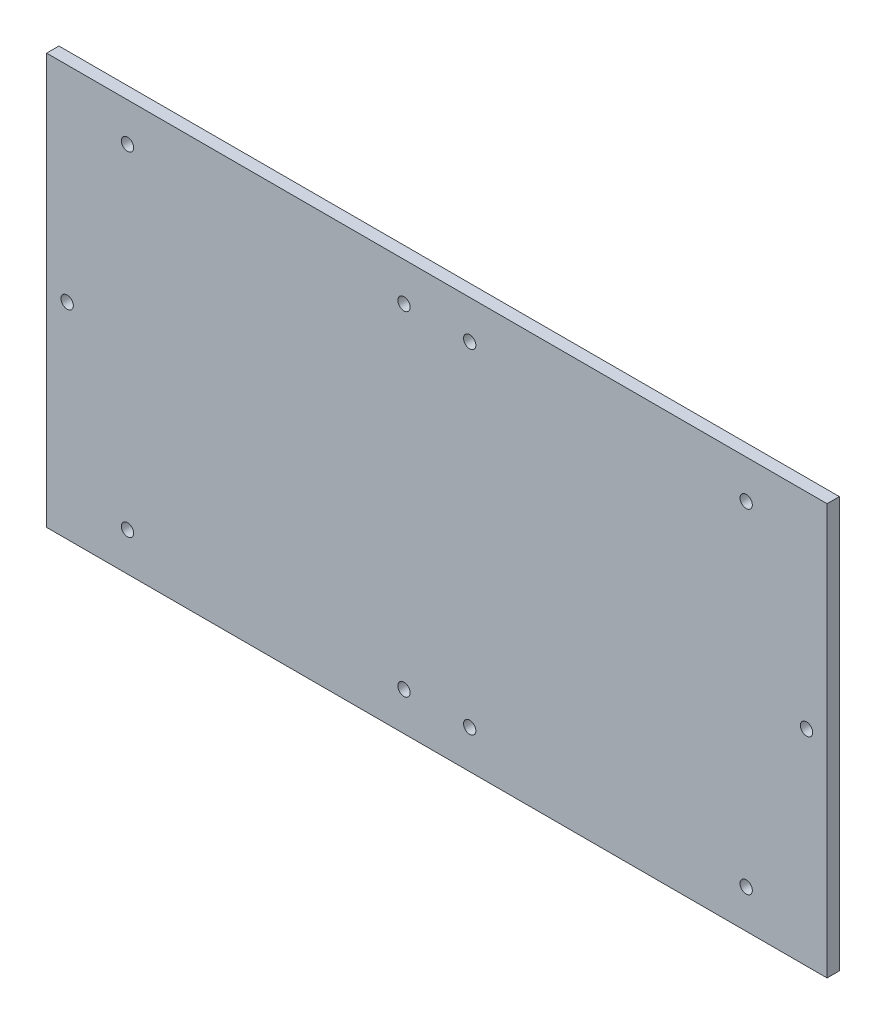
ISO-10303-21;
HEADER;
FILE_DESCRIPTION(('STEP AP214'),'2;1');
FILE_NAME('part.step','',(''),(''),'','','');
FILE_SCHEMA(('AUTOMOTIVE_DESIGN { 1 0 10303 214 1 1 1 1 }'));
ENDSEC;
DATA;
#1=APPLICATION_CONTEXT('core data for automotive mechanical design processes');
#2=APPLICATION_PROTOCOL_DEFINITION('international standard','automotive_design',2000,#1);
#3=PRODUCT_CONTEXT('',#1,'mechanical');
#4=PRODUCT('Part','Part','',(#3));
#5=PRODUCT_RELATED_PRODUCT_CATEGORY('part','',(#4));
#6=PRODUCT_DEFINITION_FORMATION('','',#4);
#7=PRODUCT_DEFINITION_CONTEXT('part definition',#1,'design');
#8=PRODUCT_DEFINITION('design','',#6,#7);
#9=PRODUCT_DEFINITION_SHAPE('','',#8);
#10=(LENGTH_UNIT() NAMED_UNIT(*) SI_UNIT(.MILLI.,.METRE.));
#11=(NAMED_UNIT(*) PLANE_ANGLE_UNIT() SI_UNIT($,.RADIAN.));
#12=(NAMED_UNIT(*) SI_UNIT($,.STERADIAN.) SOLID_ANGLE_UNIT());
#13=UNCERTAINTY_MEASURE_WITH_UNIT(LENGTH_MEASURE(1.E-05),#10,'distance_accuracy_value','');
#14=(GEOMETRIC_REPRESENTATION_CONTEXT(3) GLOBAL_UNCERTAINTY_ASSIGNED_CONTEXT((#13)) GLOBAL_UNIT_ASSIGNED_CONTEXT((#10,
#11,#12)) REPRESENTATION_CONTEXT('',''));
#15=CARTESIAN_POINT('',(0.,0.,0.));
#16=DIRECTION('',(0.,0.,1.));
#17=DIRECTION('',(1.,0.,0.));
#18=AXIS2_PLACEMENT_3D('',#15,#16,#17);
#19=CARTESIAN_POINT('',(95.,50.,3.));
#20=DIRECTION('',(-1.,0.,0.));
#21=DIRECTION('',(0.,0.,1.));
#22=AXIS2_PLACEMENT_3D('',#19,#20,#21);
#23=PLANE('',#22);
#24=DIRECTION('',(0.,1.,0.));
#25=VECTOR('',#24,1.);
#26=CARTESIAN_POINT('',(95.,50.,0.));
#27=LINE('',#26,#25);
#28=CARTESIAN_POINT('',(95.,-50.,0.));
#29=VERTEX_POINT('',#28);
#30=CARTESIAN_POINT('',(95.,50.,0.));
#31=VERTEX_POINT('',#30);
#32=EDGE_CURVE('E114',#29,#31,#27,.T.);
#33=ORIENTED_EDGE('',*,*,#32,.T.);
#34=DIRECTION('',(0.,0.,-1.));
#35=VECTOR('',#34,1.);
#36=CARTESIAN_POINT('',(95.,50.,3.));
#37=LINE('',#36,#35);
#38=CARTESIAN_POINT('',(95.,50.,3.));
#39=VERTEX_POINT('',#38);
#40=EDGE_CURVE('E11',#39,#31,#37,.T.);
#41=ORIENTED_EDGE('',*,*,#40,.F.);
#42=DIRECTION('',(0.,1.,0.));
#43=VECTOR('',#42,1.);
#44=CARTESIAN_POINT('',(95.,50.,3.));
#45=LINE('',#44,#43);
#46=CARTESIAN_POINT('',(95.,-50.,3.));
#47=VERTEX_POINT('',#46);
#48=EDGE_CURVE('E97',#47,#39,#45,.T.);
#49=ORIENTED_EDGE('',*,*,#48,.F.);
#50=DIRECTION('',(0.,0.,-1.));
#51=VECTOR('',#50,1.);
#52=CARTESIAN_POINT('',(95.,-50.,3.));
#53=LINE('',#52,#51);
#54=EDGE_CURVE('E110',#47,#29,#53,.T.);
#55=ORIENTED_EDGE('',*,*,#54,.T.);
#56=EDGE_LOOP('',(#33,#41,#49,#55));
#57=FACE_BOUND('',#56,.T.);
#58=ADVANCED_FACE('F43',(#57),#23,.F.);
#59=CARTESIAN_POINT('',(-95.,50.,3.));
#60=DIRECTION('',(0.,-1.,0.));
#61=DIRECTION('',(0.,0.,-1.));
#62=AXIS2_PLACEMENT_3D('',#59,#60,#61);
#63=PLANE('',#62);
#64=DIRECTION('',(-1.,0.,0.));
#65=VECTOR('',#64,1.);
#66=CARTESIAN_POINT('',(-95.,50.,0.));
#67=LINE('',#66,#65);
#68=CARTESIAN_POINT('',(-95.,50.,0.));
#69=VERTEX_POINT('',#68);
#70=EDGE_CURVE('E102',#31,#69,#67,.T.);
#71=ORIENTED_EDGE('',*,*,#70,.T.);
#72=DIRECTION('',(0.,0.,-1.));
#73=VECTOR('',#72,1.);
#74=CARTESIAN_POINT('',(-95.,50.,3.));
#75=LINE('',#74,#73);
#76=CARTESIAN_POINT('',(-95.,50.,3.));
#77=VERTEX_POINT('',#76);
#78=EDGE_CURVE('E53',#77,#69,#75,.T.);
#79=ORIENTED_EDGE('',*,*,#78,.F.);
#80=DIRECTION('',(-1.,0.,0.));
#81=VECTOR('',#80,1.);
#82=CARTESIAN_POINT('',(-95.,50.,3.));
#83=LINE('',#82,#81);
#84=EDGE_CURVE('E92',#39,#77,#83,.T.);
#85=ORIENTED_EDGE('',*,*,#84,.F.);
#86=ORIENTED_EDGE('',*,*,#40,.T.);
#87=EDGE_LOOP('',(#71,#79,#85,#86));
#88=FACE_BOUND('',#87,.T.);
#89=ADVANCED_FACE('F101',(#88),#63,.F.);
#90=CARTESIAN_POINT('',(-95.,50.,3.));
#91=DIRECTION('',(1.,0.,0.));
#92=DIRECTION('',(0.,0.,-1.));
#93=AXIS2_PLACEMENT_3D('',#90,#91,#92);
#94=PLANE('',#93);
#95=DIRECTION('',(0.,-1.,0.));
#96=VECTOR('',#95,1.);
#97=CARTESIAN_POINT('',(-95.,50.,0.));
#98=LINE('',#97,#96);
#99=CARTESIAN_POINT('',(-95.,-50.,0.));
#100=VERTEX_POINT('',#99);
#101=EDGE_CURVE('E79',#69,#100,#98,.T.);
#102=ORIENTED_EDGE('',*,*,#101,.T.);
#103=DIRECTION('',(0.,0.,-1.));
#104=VECTOR('',#103,1.);
#105=CARTESIAN_POINT('',(-95.,-50.,3.));
#106=LINE('',#105,#104);
#107=CARTESIAN_POINT('',(-95.,-50.,3.));
#108=VERTEX_POINT('',#107);
#109=EDGE_CURVE('E104',#108,#100,#106,.T.);
#110=ORIENTED_EDGE('',*,*,#109,.F.);
#111=DIRECTION('',(0.,-1.,0.));
#112=VECTOR('',#111,1.);
#113=CARTESIAN_POINT('',(-95.,50.,3.));
#114=LINE('',#113,#112);
#115=EDGE_CURVE('E95',#77,#108,#114,.T.);
#116=ORIENTED_EDGE('',*,*,#115,.F.);
#117=ORIENTED_EDGE('',*,*,#78,.T.);
#118=EDGE_LOOP('',(#102,#110,#116,#117));
#119=FACE_BOUND('',#118,.T.);
#120=ADVANCED_FACE('F106',(#119),#94,.F.);
#121=CARTESIAN_POINT('',(-95.,-50.,3.));
#122=DIRECTION('',(0.,1.,0.));
#123=DIRECTION('',(0.,0.,1.));
#124=AXIS2_PLACEMENT_3D('',#121,#122,#123);
#125=PLANE('',#124);
#126=DIRECTION('',(1.,0.,0.));
#127=VECTOR('',#126,1.);
#128=CARTESIAN_POINT('',(-95.,-50.,0.));
#129=LINE('',#128,#127);
#130=EDGE_CURVE('E85',#100,#29,#129,.T.);
#131=ORIENTED_EDGE('',*,*,#130,.T.);
#132=ORIENTED_EDGE('',*,*,#54,.F.);
#133=DIRECTION('',(1.,0.,0.));
#134=VECTOR('',#133,1.);
#135=CARTESIAN_POINT('',(-95.,-50.,3.));
#136=LINE('',#135,#134);
#137=EDGE_CURVE('E62',#108,#47,#136,.T.);
#138=ORIENTED_EDGE('',*,*,#137,.F.);
#139=ORIENTED_EDGE('',*,*,#109,.T.);
#140=EDGE_LOOP('',(#131,#132,#138,#139));
#141=FACE_BOUND('',#140,.T.);
#142=ADVANCED_FACE('F201',(#141),#125,.F.);
#143=CARTESIAN_POINT('',(0.,0.,3.));
#144=DIRECTION('',(0.,0.,1.));
#145=DIRECTION('',(1.,0.,0.));
#146=AXIS2_PLACEMENT_3D('',#143,#144,#145);
#147=PLANE('',#146);
#148=CARTESIAN_POINT('',(75.31,40.64,3.));
#149=DIRECTION('',(0.,0.,1.));
#150=DIRECTION('',(1.,0.,0.));
#151=AXIS2_PLACEMENT_3D('',#148,#149,#150);
#152=CIRCLE('',#151,1.5);
#153=CARTESIAN_POINT('',(76.81,40.64,3.));
#154=VERTEX_POINT('',#153);
#155=EDGE_CURVE('E390',#154,#154,#152,.T.);
#156=ORIENTED_EDGE('',*,*,#155,.F.);
#157=EDGE_LOOP('',(#156));
#158=FACE_BOUND('',#157,.T.);
#159=CARTESIAN_POINT('',(75.31,-40.64,3.));
#160=DIRECTION('',(0.,0.,1.));
#161=DIRECTION('',(1.,0.,0.));
#162=AXIS2_PLACEMENT_3D('',#159,#160,#161);
#163=CIRCLE('',#162,1.5);
#164=CARTESIAN_POINT('',(76.81,-40.64,3.));
#165=VERTEX_POINT('',#164);
#166=EDGE_CURVE('E384',#165,#165,#163,.T.);
#167=ORIENTED_EDGE('',*,*,#166,.F.);
#168=EDGE_LOOP('',(#167));
#169=FACE_BOUND('',#168,.T.);
#170=CARTESIAN_POINT('',(-7.99996360123814,-40.6399999999998,3.));
#171=DIRECTION('',(0.,0.,1.));
#172=DIRECTION('',(1.,0.,0.));
#173=AXIS2_PLACEMENT_3D('',#170,#171,#172);
#174=CIRCLE('',#173,1.49999999999997);
#175=CARTESIAN_POINT('',(-6.49996360123817,-40.6399999999998,3.));
#176=VERTEX_POINT('',#175);
#177=EDGE_CURVE('E358',#176,#176,#174,.T.);
#178=ORIENTED_EDGE('',*,*,#177,.F.);
#179=EDGE_LOOP('',(#178));
#180=FACE_BOUND('',#179,.T.);
#181=CARTESIAN_POINT('',(90.,0.,3.));
#182=DIRECTION('',(0.,0.,1.));
#183=DIRECTION('',(1.,0.,0.));
#184=AXIS2_PLACEMENT_3D('',#181,#182,#183);
#185=CIRCLE('',#184,1.5);
#186=CARTESIAN_POINT('',(91.5,0.,3.));
#187=VERTEX_POINT('',#186);
#188=EDGE_CURVE('E385',#187,#187,#185,.T.);
#189=ORIENTED_EDGE('',*,*,#188,.F.);
#190=EDGE_LOOP('',(#189));
#191=FACE_BOUND('',#190,.T.);
#192=CARTESIAN_POINT('',(8.,40.64,3.));
#193=DIRECTION('',(0.,0.,1.));
#194=DIRECTION('',(1.,0.,0.));
#195=AXIS2_PLACEMENT_3D('',#192,#193,#194);
#196=CIRCLE('',#195,1.5);
#197=CARTESIAN_POINT('',(9.5,40.64,3.));
#198=VERTEX_POINT('',#197);
#199=EDGE_CURVE('E408',#198,#198,#196,.T.);
#200=ORIENTED_EDGE('',*,*,#199,.F.);
#201=EDGE_LOOP('',(#200));
#202=FACE_BOUND('',#201,.T.);
#203=CARTESIAN_POINT('',(-90.,0.,3.));
#204=DIRECTION('',(0.,0.,1.));
#205=DIRECTION('',(1.,0.,0.));
#206=AXIS2_PLACEMENT_3D('',#203,#204,#205);
#207=CIRCLE('',#206,1.5);
#208=CARTESIAN_POINT('',(-88.5,0.,3.));
#209=VERTEX_POINT('',#208);
#210=EDGE_CURVE('E404',#209,#209,#207,.T.);
#211=ORIENTED_EDGE('',*,*,#210,.F.);
#212=EDGE_LOOP('',(#211));
#213=FACE_BOUND('',#212,.T.);
#214=CARTESIAN_POINT('',(-75.3099636012381,40.64,3.));
#215=DIRECTION('',(0.,0.,1.));
#216=DIRECTION('',(1.,0.,0.));
#217=AXIS2_PLACEMENT_3D('',#214,#215,#216);
#218=CIRCLE('',#217,1.49999999999997);
#219=CARTESIAN_POINT('',(-73.8099636012381,40.64,3.));
#220=VERTEX_POINT('',#219);
#221=EDGE_CURVE('E400',#220,#220,#218,.T.);
#222=ORIENTED_EDGE('',*,*,#221,.F.);
#223=EDGE_LOOP('',(#222));
#224=FACE_BOUND('',#223,.T.);
#225=CARTESIAN_POINT('',(-75.3099636012381,-40.64,3.));
#226=DIRECTION('',(0.,0.,1.));
#227=DIRECTION('',(1.,0.,0.));
#228=AXIS2_PLACEMENT_3D('',#225,#226,#227);
#229=CIRCLE('',#228,1.50000000000001);
#230=CARTESIAN_POINT('',(-73.8099636012381,-40.64,3.));
#231=VERTEX_POINT('',#230);
#232=EDGE_CURVE('E398',#231,#231,#229,.T.);
#233=ORIENTED_EDGE('',*,*,#232,.F.);
#234=EDGE_LOOP('',(#233));
#235=FACE_BOUND('',#234,.T.);
#236=CARTESIAN_POINT('',(8.00000000000001,-40.64,3.));
#237=DIRECTION('',(0.,0.,1.));
#238=DIRECTION('',(1.,0.,0.));
#239=AXIS2_PLACEMENT_3D('',#236,#237,#238);
#240=CIRCLE('',#239,1.49999999999999);
#241=CARTESIAN_POINT('',(9.5,-40.64,3.));
#242=VERTEX_POINT('',#241);
#243=EDGE_CURVE('E393',#242,#242,#240,.T.);
#244=ORIENTED_EDGE('',*,*,#243,.F.);
#245=EDGE_LOOP('',(#244));
#246=FACE_BOUND('',#245,.T.);
#247=CARTESIAN_POINT('',(-7.9999636012381,40.6400000000002,3.));
#248=DIRECTION('',(0.,0.,1.));
#249=DIRECTION('',(1.,0.,0.));
#250=AXIS2_PLACEMENT_3D('',#247,#248,#249);
#251=CIRCLE('',#250,1.49999999999992);
#252=CARTESIAN_POINT('',(-6.49996360123817,40.6400000000002,3.));
#253=VERTEX_POINT('',#252);
#254=EDGE_CURVE('E133',#253,#253,#251,.T.);
#255=ORIENTED_EDGE('',*,*,#254,.F.);
#256=EDGE_LOOP('',(#255));
#257=FACE_BOUND('',#256,.T.);
#258=ORIENTED_EDGE('',*,*,#48,.T.);
#259=ORIENTED_EDGE('',*,*,#84,.T.);
#260=ORIENTED_EDGE('',*,*,#115,.T.);
#261=ORIENTED_EDGE('',*,*,#137,.T.);
#262=EDGE_LOOP('',(#258,#259,#260,#261));
#263=FACE_BOUND('',#262,.T.);
#264=ADVANCED_FACE('F93',(#158,#169,#180,#191,#202,#213,#224,#235,#246,#257,#263),#147,.T.);
#265=CARTESIAN_POINT('',(0.,0.,0.));
#266=DIRECTION('',(0.,0.,1.));
#267=DIRECTION('',(1.,0.,0.));
#268=AXIS2_PLACEMENT_3D('',#265,#266,#267);
#269=PLANE('',#268);
#270=CARTESIAN_POINT('',(75.31,40.64,0.));
#271=DIRECTION('',(0.,0.,1.));
#272=DIRECTION('',(1.,0.,0.));
#273=AXIS2_PLACEMENT_3D('',#270,#271,#272);
#274=CIRCLE('',#273,1.5);
#275=CARTESIAN_POINT('',(76.81,40.64,0.));
#276=VERTEX_POINT('',#275);
#277=EDGE_CURVE('E46',#276,#276,#274,.T.);
#278=ORIENTED_EDGE('',*,*,#277,.T.);
#279=EDGE_LOOP('',(#278));
#280=FACE_BOUND('',#279,.T.);
#281=CARTESIAN_POINT('',(75.31,-40.64,0.));
#282=DIRECTION('',(0.,0.,1.));
#283=DIRECTION('',(1.,0.,0.));
#284=AXIS2_PLACEMENT_3D('',#281,#282,#283);
#285=CIRCLE('',#284,1.5);
#286=CARTESIAN_POINT('',(76.81,-40.64,0.));
#287=VERTEX_POINT('',#286);
#288=EDGE_CURVE('E160',#287,#287,#285,.T.);
#289=ORIENTED_EDGE('',*,*,#288,.T.);
#290=EDGE_LOOP('',(#289));
#291=FACE_BOUND('',#290,.T.);
#292=CARTESIAN_POINT('',(-7.99996360123814,-40.6399999999998,0.));
#293=DIRECTION('',(0.,0.,1.));
#294=DIRECTION('',(1.,0.,0.));
#295=AXIS2_PLACEMENT_3D('',#292,#293,#294);
#296=CIRCLE('',#295,1.49999999999997);
#297=CARTESIAN_POINT('',(-6.49996360123817,-40.6399999999998,0.));
#298=VERTEX_POINT('',#297);
#299=EDGE_CURVE('E157',#298,#298,#296,.T.);
#300=ORIENTED_EDGE('',*,*,#299,.T.);
#301=EDGE_LOOP('',(#300));
#302=FACE_BOUND('',#301,.T.);
#303=CARTESIAN_POINT('',(90.,0.,0.));
#304=DIRECTION('',(0.,0.,1.));
#305=DIRECTION('',(1.,0.,0.));
#306=AXIS2_PLACEMENT_3D('',#303,#304,#305);
#307=CIRCLE('',#306,1.5);
#308=CARTESIAN_POINT('',(91.5,0.,0.));
#309=VERTEX_POINT('',#308);
#310=EDGE_CURVE('E153',#309,#309,#307,.T.);
#311=ORIENTED_EDGE('',*,*,#310,.T.);
#312=EDGE_LOOP('',(#311));
#313=FACE_BOUND('',#312,.T.);
#314=CARTESIAN_POINT('',(8.,40.64,0.));
#315=DIRECTION('',(0.,0.,1.));
#316=DIRECTION('',(1.,0.,0.));
#317=AXIS2_PLACEMENT_3D('',#314,#315,#316);
#318=CIRCLE('',#317,1.5);
#319=CARTESIAN_POINT('',(9.5,40.64,0.));
#320=VERTEX_POINT('',#319);
#321=EDGE_CURVE('E149',#320,#320,#318,.T.);
#322=ORIENTED_EDGE('',*,*,#321,.T.);
#323=EDGE_LOOP('',(#322));
#324=FACE_BOUND('',#323,.T.);
#325=CARTESIAN_POINT('',(-90.,0.,0.));
#326=DIRECTION('',(0.,0.,1.));
#327=DIRECTION('',(1.,0.,0.));
#328=AXIS2_PLACEMENT_3D('',#325,#326,#327);
#329=CIRCLE('',#328,1.5);
#330=CARTESIAN_POINT('',(-88.5,0.,0.));
#331=VERTEX_POINT('',#330);
#332=EDGE_CURVE('E145',#331,#331,#329,.T.);
#333=ORIENTED_EDGE('',*,*,#332,.T.);
#334=EDGE_LOOP('',(#333));
#335=FACE_BOUND('',#334,.T.);
#336=CARTESIAN_POINT('',(-75.3099636012381,40.64,0.));
#337=DIRECTION('',(0.,0.,1.));
#338=DIRECTION('',(1.,0.,0.));
#339=AXIS2_PLACEMENT_3D('',#336,#337,#338);
#340=CIRCLE('',#339,1.49999999999997);
#341=CARTESIAN_POINT('',(-73.8099636012381,40.64,0.));
#342=VERTEX_POINT('',#341);
#343=EDGE_CURVE('E141',#342,#342,#340,.T.);
#344=ORIENTED_EDGE('',*,*,#343,.T.);
#345=EDGE_LOOP('',(#344));
#346=FACE_BOUND('',#345,.T.);
#347=CARTESIAN_POINT('',(-75.3099636012381,-40.64,0.));
#348=DIRECTION('',(0.,0.,1.));
#349=DIRECTION('',(1.,0.,0.));
#350=AXIS2_PLACEMENT_3D('',#347,#348,#349);
#351=CIRCLE('',#350,1.50000000000001);
#352=CARTESIAN_POINT('',(-73.8099636012381,-40.64,0.));
#353=VERTEX_POINT('',#352);
#354=EDGE_CURVE('E137',#353,#353,#351,.T.);
#355=ORIENTED_EDGE('',*,*,#354,.T.);
#356=EDGE_LOOP('',(#355));
#357=FACE_BOUND('',#356,.T.);
#358=CARTESIAN_POINT('',(8.00000000000001,-40.64,0.));
#359=DIRECTION('',(0.,0.,1.));
#360=DIRECTION('',(1.,0.,0.));
#361=AXIS2_PLACEMENT_3D('',#358,#359,#360);
#362=CIRCLE('',#361,1.49999999999999);
#363=CARTESIAN_POINT('',(9.5,-40.64,0.));
#364=VERTEX_POINT('',#363);
#365=EDGE_CURVE('E132',#364,#364,#362,.T.);
#366=ORIENTED_EDGE('',*,*,#365,.T.);
#367=EDGE_LOOP('',(#366));
#368=FACE_BOUND('',#367,.T.);
#369=CARTESIAN_POINT('',(-7.9999636012381,40.6400000000002,0.));
#370=DIRECTION('',(0.,0.,1.));
#371=DIRECTION('',(1.,0.,0.));
#372=AXIS2_PLACEMENT_3D('',#369,#370,#371);
#373=CIRCLE('',#372,1.49999999999992);
#374=CARTESIAN_POINT('',(-6.49996360123817,40.6400000000002,0.));
#375=VERTEX_POINT('',#374);
#376=EDGE_CURVE('E128',#375,#375,#373,.T.);
#377=ORIENTED_EDGE('',*,*,#376,.T.);
#378=EDGE_LOOP('',(#377));
#379=FACE_BOUND('',#378,.T.);
#380=ORIENTED_EDGE('',*,*,#32,.F.);
#381=ORIENTED_EDGE('',*,*,#130,.F.);
#382=ORIENTED_EDGE('',*,*,#101,.F.);
#383=ORIENTED_EDGE('',*,*,#70,.F.);
#384=EDGE_LOOP('',(#380,#381,#382,#383));
#385=FACE_BOUND('',#384,.T.);
#386=ADVANCED_FACE('F169',(#280,#291,#302,#313,#324,#335,#346,#357,#368,#379,#385),#269,.F.);
#387=CARTESIAN_POINT('',(-7.9999636012381,40.6400000000002,-1.));
#388=DIRECTION('',(0.,0.,1.));
#389=DIRECTION('',(1.,0.,0.));
#390=AXIS2_PLACEMENT_3D('',#387,#388,#389);
#391=CYLINDRICAL_SURFACE('',#390,1.49999999999992);
#392=ORIENTED_EDGE('',*,*,#254,.T.);
#393=EDGE_LOOP('',(#392));
#394=FACE_BOUND('',#393,.T.);
#395=ORIENTED_EDGE('',*,*,#376,.F.);
#396=EDGE_LOOP('',(#395));
#397=FACE_BOUND('',#396,.T.);
#398=ADVANCED_FACE('F192',(#394,#397),#391,.F.);
#399=CARTESIAN_POINT('',(8.00000000000001,-40.64,-1.));
#400=DIRECTION('',(0.,0.,1.));
#401=DIRECTION('',(1.,0.,0.));
#402=AXIS2_PLACEMENT_3D('',#399,#400,#401);
#403=CYLINDRICAL_SURFACE('',#402,1.49999999999999);
#404=ORIENTED_EDGE('',*,*,#243,.T.);
#405=EDGE_LOOP('',(#404));
#406=FACE_BOUND('',#405,.T.);
#407=ORIENTED_EDGE('',*,*,#365,.F.);
#408=EDGE_LOOP('',(#407));
#409=FACE_BOUND('',#408,.T.);
#410=ADVANCED_FACE('F198',(#406,#409),#403,.F.);
#411=CARTESIAN_POINT('',(-75.3099636012381,-40.64,-1.));
#412=DIRECTION('',(0.,0.,1.));
#413=DIRECTION('',(1.,0.,0.));
#414=AXIS2_PLACEMENT_3D('',#411,#412,#413);
#415=CYLINDRICAL_SURFACE('',#414,1.50000000000001);
#416=ORIENTED_EDGE('',*,*,#232,.T.);
#417=EDGE_LOOP('',(#416));
#418=FACE_BOUND('',#417,.T.);
#419=ORIENTED_EDGE('',*,*,#354,.F.);
#420=EDGE_LOOP('',(#419));
#421=FACE_BOUND('',#420,.T.);
#422=ADVANCED_FACE('F242',(#418,#421),#415,.F.);
#423=CARTESIAN_POINT('',(-75.3099636012381,40.64,-1.));
#424=DIRECTION('',(0.,0.,1.));
#425=DIRECTION('',(1.,0.,0.));
#426=AXIS2_PLACEMENT_3D('',#423,#424,#425);
#427=CYLINDRICAL_SURFACE('',#426,1.49999999999997);
#428=ORIENTED_EDGE('',*,*,#221,.T.);
#429=EDGE_LOOP('',(#428));
#430=FACE_BOUND('',#429,.T.);
#431=ORIENTED_EDGE('',*,*,#343,.F.);
#432=EDGE_LOOP('',(#431));
#433=FACE_BOUND('',#432,.T.);
#434=ADVANCED_FACE('F253',(#430,#433),#427,.F.);
#435=CARTESIAN_POINT('',(-90.,0.,-1.));
#436=DIRECTION('',(0.,0.,1.));
#437=DIRECTION('',(1.,0.,0.));
#438=AXIS2_PLACEMENT_3D('',#435,#436,#437);
#439=CYLINDRICAL_SURFACE('',#438,1.5);
#440=ORIENTED_EDGE('',*,*,#210,.T.);
#441=EDGE_LOOP('',(#440));
#442=FACE_BOUND('',#441,.T.);
#443=ORIENTED_EDGE('',*,*,#332,.F.);
#444=EDGE_LOOP('',(#443));
#445=FACE_BOUND('',#444,.T.);
#446=ADVANCED_FACE('F264',(#442,#445),#439,.F.);
#447=CARTESIAN_POINT('',(8.,40.64,-1.));
#448=DIRECTION('',(0.,0.,1.));
#449=DIRECTION('',(1.,0.,0.));
#450=AXIS2_PLACEMENT_3D('',#447,#448,#449);
#451=CYLINDRICAL_SURFACE('',#450,1.5);
#452=ORIENTED_EDGE('',*,*,#199,.T.);
#453=EDGE_LOOP('',(#452));
#454=FACE_BOUND('',#453,.T.);
#455=ORIENTED_EDGE('',*,*,#321,.F.);
#456=EDGE_LOOP('',(#455));
#457=FACE_BOUND('',#456,.T.);
#458=ADVANCED_FACE('F275',(#454,#457),#451,.F.);
#459=CARTESIAN_POINT('',(90.,0.,-1.));
#460=DIRECTION('',(0.,0.,1.));
#461=DIRECTION('',(1.,0.,0.));
#462=AXIS2_PLACEMENT_3D('',#459,#460,#461);
#463=CYLINDRICAL_SURFACE('',#462,1.5);
#464=ORIENTED_EDGE('',*,*,#188,.T.);
#465=EDGE_LOOP('',(#464));
#466=FACE_BOUND('',#465,.T.);
#467=ORIENTED_EDGE('',*,*,#310,.F.);
#468=EDGE_LOOP('',(#467));
#469=FACE_BOUND('',#468,.T.);
#470=ADVANCED_FACE('F286',(#466,#469),#463,.F.);
#471=CARTESIAN_POINT('',(-7.99996360123814,-40.6399999999998,-1.));
#472=DIRECTION('',(0.,0.,1.));
#473=DIRECTION('',(1.,0.,0.));
#474=AXIS2_PLACEMENT_3D('',#471,#472,#473);
#475=CYLINDRICAL_SURFACE('',#474,1.49999999999997);
#476=ORIENTED_EDGE('',*,*,#177,.T.);
#477=EDGE_LOOP('',(#476));
#478=FACE_BOUND('',#477,.T.);
#479=ORIENTED_EDGE('',*,*,#299,.F.);
#480=EDGE_LOOP('',(#479));
#481=FACE_BOUND('',#480,.T.);
#482=ADVANCED_FACE('F179',(#478,#481),#475,.F.);
#483=CARTESIAN_POINT('',(75.31,-40.64,-1.));
#484=DIRECTION('',(0.,0.,1.));
#485=DIRECTION('',(1.,0.,0.));
#486=AXIS2_PLACEMENT_3D('',#483,#484,#485);
#487=CYLINDRICAL_SURFACE('',#486,1.5);
#488=ORIENTED_EDGE('',*,*,#166,.T.);
#489=EDGE_LOOP('',(#488));
#490=FACE_BOUND('',#489,.T.);
#491=ORIENTED_EDGE('',*,*,#288,.F.);
#492=EDGE_LOOP('',(#491));
#493=FACE_BOUND('',#492,.T.);
#494=ADVANCED_FACE('F173',(#490,#493),#487,.F.);
#495=CARTESIAN_POINT('',(75.31,40.64,-1.));
#496=DIRECTION('',(0.,0.,1.));
#497=DIRECTION('',(1.,0.,0.));
#498=AXIS2_PLACEMENT_3D('',#495,#496,#497);
#499=CYLINDRICAL_SURFACE('',#498,1.5);
#500=ORIENTED_EDGE('',*,*,#155,.T.);
#501=EDGE_LOOP('',(#500));
#502=FACE_BOUND('',#501,.T.);
#503=ORIENTED_EDGE('',*,*,#277,.F.);
#504=EDGE_LOOP('',(#503));
#505=FACE_BOUND('',#504,.T.);
#506=ADVANCED_FACE('F171',(#502,#505),#499,.F.);
#507=CLOSED_SHELL('',(#58,#89,#120,#142,#264,#386,#398,#410,#422,#434,#446,#458,#470,#482,#494,#506));
#508=MANIFOLD_SOLID_BREP('B2',#507);
#509=ADVANCED_BREP_SHAPE_REPRESENTATION('',(#18,#508),#14);
#510=SHAPE_DEFINITION_REPRESENTATION(#9,#509);
ENDSEC;
END-ISO-10303-21;
